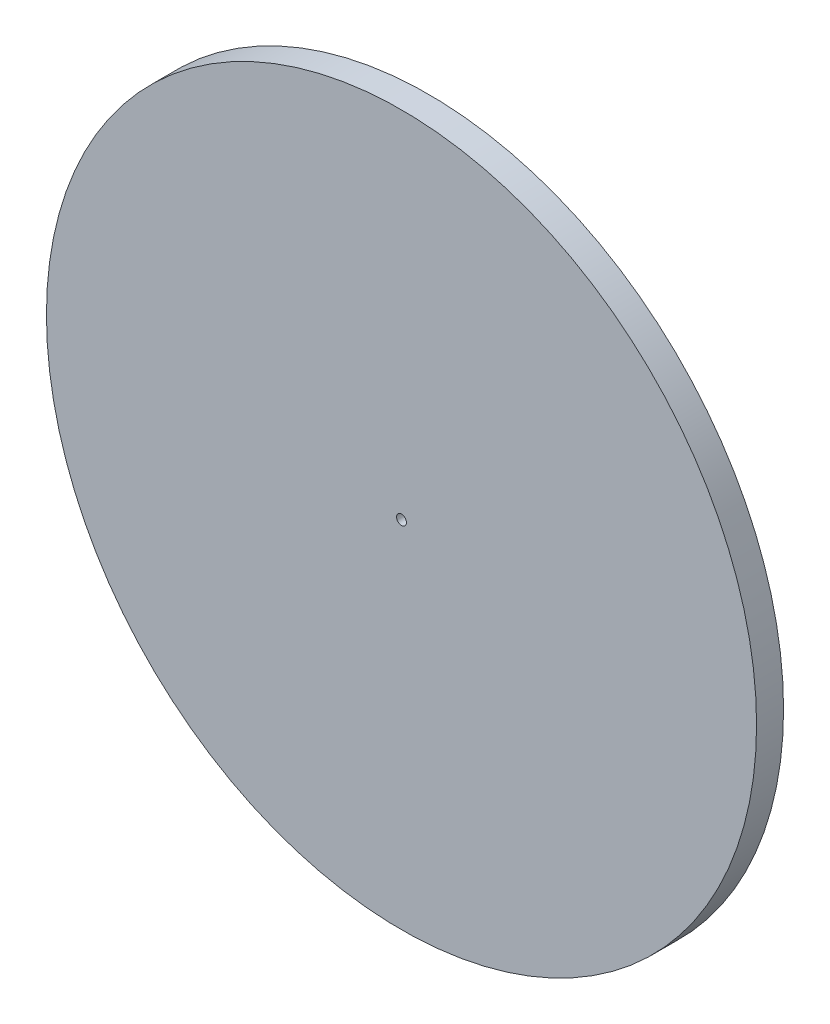
ISO-10303-21;
HEADER;
FILE_DESCRIPTION(('STEP AP214'),'2;1');
FILE_NAME('part.step','',(''),(''),'','','');
FILE_SCHEMA(('AUTOMOTIVE_DESIGN { 1 0 10303 214 1 1 1 1 }'));
ENDSEC;
DATA;
#1=APPLICATION_CONTEXT('core data for automotive mechanical design processes');
#2=APPLICATION_PROTOCOL_DEFINITION('international standard','automotive_design',2000,#1);
#3=PRODUCT_CONTEXT('',#1,'mechanical');
#4=PRODUCT('Part','Part','',(#3));
#5=PRODUCT_RELATED_PRODUCT_CATEGORY('part','',(#4));
#6=PRODUCT_DEFINITION_FORMATION('','',#4);
#7=PRODUCT_DEFINITION_CONTEXT('part definition',#1,'design');
#8=PRODUCT_DEFINITION('design','',#6,#7);
#9=PRODUCT_DEFINITION_SHAPE('','',#8);
#10=(LENGTH_UNIT() NAMED_UNIT(*) SI_UNIT(.MILLI.,.METRE.));
#11=(NAMED_UNIT(*) PLANE_ANGLE_UNIT() SI_UNIT($,.RADIAN.));
#12=(NAMED_UNIT(*) SI_UNIT($,.STERADIAN.) SOLID_ANGLE_UNIT());
#13=UNCERTAINTY_MEASURE_WITH_UNIT(LENGTH_MEASURE(1.E-05),#10,'distance_accuracy_value','');
#14=(GEOMETRIC_REPRESENTATION_CONTEXT(3) GLOBAL_UNCERTAINTY_ASSIGNED_CONTEXT((#13)) GLOBAL_UNIT_ASSIGNED_CONTEXT((#10,
#11,#12)) REPRESENTATION_CONTEXT('',''));
#15=CARTESIAN_POINT('',(0.,0.,0.));
#16=DIRECTION('',(0.,0.,1.));
#17=DIRECTION('',(1.,0.,0.));
#18=AXIS2_PLACEMENT_3D('',#15,#16,#17);
#19=CARTESIAN_POINT('',(0.,0.,9.5));
#20=DIRECTION('',(0.,0.,-1.));
#21=DIRECTION('',(-1.,0.,0.));
#22=AXIS2_PLACEMENT_3D('',#19,#20,#21);
#23=CYLINDRICAL_SURFACE('',#22,3.5);
#24=CARTESIAN_POINT('',(0.,0.,9.5));
#25=DIRECTION('',(0.,0.,1.));
#26=DIRECTION('',(1.,0.,0.));
#27=AXIS2_PLACEMENT_3D('',#24,#25,#26);
#28=CIRCLE('',#27,3.5);
#29=CARTESIAN_POINT('',(3.5,0.,9.5));
#30=VERTEX_POINT('',#29);
#31=EDGE_CURVE('E52',#30,#30,#28,.T.);
#32=ORIENTED_EDGE('',*,*,#31,.T.);
#33=EDGE_LOOP('',(#32));
#34=FACE_BOUND('',#33,.T.);
#35=CARTESIAN_POINT('',(0.,0.,-0.5));
#36=DIRECTION('',(0.,0.,-1.));
#37=DIRECTION('',(-1.,0.,0.));
#38=AXIS2_PLACEMENT_3D('',#35,#36,#37);
#39=CIRCLE('',#38,3.5);
#40=CARTESIAN_POINT('',(-3.5,0.,-0.5));
#41=VERTEX_POINT('',#40);
#42=EDGE_CURVE('E41',#41,#41,#39,.T.);
#43=ORIENTED_EDGE('',*,*,#42,.T.);
#44=EDGE_LOOP('',(#43));
#45=FACE_BOUND('',#44,.T.);
#46=ADVANCED_FACE('F37',(#34,#45),#23,.F.);
#47=CARTESIAN_POINT('',(0.,0.,9.5));
#48=DIRECTION('',(0.,0.,1.));
#49=DIRECTION('',(1.,0.,0.));
#50=AXIS2_PLACEMENT_3D('',#47,#48,#49);
#51=PLANE('',#50);
#52=CARTESIAN_POINT('',(0.,0.,9.5));
#53=DIRECTION('',(0.,0.,1.));
#54=DIRECTION('',(1.,0.,0.));
#55=AXIS2_PLACEMENT_3D('',#52,#53,#54);
#56=CIRCLE('',#55,250.);
#57=CARTESIAN_POINT('',(250.,0.,9.5));
#58=VERTEX_POINT('',#57);
#59=EDGE_CURVE('E10',#58,#58,#56,.T.);
#60=ORIENTED_EDGE('',*,*,#59,.T.);
#61=EDGE_LOOP('',(#60));
#62=FACE_BOUND('',#61,.T.);
#63=ORIENTED_EDGE('',*,*,#31,.F.);
#64=EDGE_LOOP('',(#63));
#65=FACE_BOUND('',#64,.T.);
#66=ADVANCED_FACE('F81',(#62,#65),#51,.T.);
#67=CARTESIAN_POINT('',(0.,0.,-9.5));
#68=DIRECTION('',(0.,0.,1.));
#69=DIRECTION('',(1.,0.,0.));
#70=AXIS2_PLACEMENT_3D('',#67,#68,#69);
#71=PLANE('',#70);
#72=CARTESIAN_POINT('',(0.,0.,-9.5));
#73=DIRECTION('',(0.,0.,-1.));
#74=DIRECTION('',(-1.,0.,0.));
#75=AXIS2_PLACEMENT_3D('',#72,#73,#74);
#76=CIRCLE('',#75,31.);
#77=CARTESIAN_POINT('',(-31.,0.,-9.5));
#78=VERTEX_POINT('',#77);
#79=EDGE_CURVE('E57',#78,#78,#76,.T.);
#80=ORIENTED_EDGE('',*,*,#79,.F.);
#81=EDGE_LOOP('',(#80));
#82=FACE_BOUND('',#81,.T.);
#83=CARTESIAN_POINT('',(0.,0.,-9.5));
#84=DIRECTION('',(0.,0.,1.));
#85=DIRECTION('',(1.,0.,0.));
#86=AXIS2_PLACEMENT_3D('',#83,#84,#85);
#87=CIRCLE('',#86,250.);
#88=CARTESIAN_POINT('',(250.,0.,-9.5));
#89=VERTEX_POINT('',#88);
#90=EDGE_CURVE('E46',#89,#89,#87,.T.);
#91=ORIENTED_EDGE('',*,*,#90,.F.);
#92=EDGE_LOOP('',(#91));
#93=FACE_BOUND('',#92,.T.);
#94=ADVANCED_FACE('F87',(#82,#93),#71,.F.);
#95=CARTESIAN_POINT('',(0.,0.,9.5));
#96=DIRECTION('',(0.,0.,-1.));
#97=DIRECTION('',(-1.,0.,0.));
#98=AXIS2_PLACEMENT_3D('',#95,#96,#97);
#99=CYLINDRICAL_SURFACE('',#98,250.);
#100=ORIENTED_EDGE('',*,*,#59,.F.);
#101=EDGE_LOOP('',(#100));
#102=FACE_BOUND('',#101,.T.);
#103=ORIENTED_EDGE('',*,*,#90,.T.);
#104=EDGE_LOOP('',(#103));
#105=FACE_BOUND('',#104,.T.);
#106=ADVANCED_FACE('F39',(#102,#105),#99,.T.);
#107=CARTESIAN_POINT('',(0.,0.,-0.5));
#108=DIRECTION('',(0.,0.,-1.));
#109=DIRECTION('',(-1.,0.,0.));
#110=AXIS2_PLACEMENT_3D('',#107,#108,#109);
#111=CYLINDRICAL_SURFACE('',#110,31.);
#112=CARTESIAN_POINT('',(0.,0.,-0.5));
#113=DIRECTION('',(0.,0.,-1.));
#114=DIRECTION('',(-1.,0.,0.));
#115=AXIS2_PLACEMENT_3D('',#112,#113,#114);
#116=CIRCLE('',#115,31.);
#117=CARTESIAN_POINT('',(-31.,0.,-0.5));
#118=VERTEX_POINT('',#117);
#119=EDGE_CURVE('E61',#118,#118,#116,.T.);
#120=ORIENTED_EDGE('',*,*,#119,.F.);
#121=EDGE_LOOP('',(#120));
#122=FACE_BOUND('',#121,.T.);
#123=ORIENTED_EDGE('',*,*,#79,.T.);
#124=EDGE_LOOP('',(#123));
#125=FACE_BOUND('',#124,.T.);
#126=ADVANCED_FACE('F73',(#122,#125),#111,.F.);
#127=CARTESIAN_POINT('',(0.,0.,-0.5));
#128=DIRECTION('',(0.,0.,-1.));
#129=DIRECTION('',(-1.,0.,0.));
#130=AXIS2_PLACEMENT_3D('',#127,#128,#129);
#131=PLANE('',#130);
#132=ORIENTED_EDGE('',*,*,#42,.F.);
#133=EDGE_LOOP('',(#132));
#134=FACE_BOUND('',#133,.T.);
#135=ORIENTED_EDGE('',*,*,#119,.T.);
#136=EDGE_LOOP('',(#135));
#137=FACE_BOUND('',#136,.T.);
#138=ADVANCED_FACE('F71',(#134,#137),#131,.T.);
#139=CLOSED_SHELL('',(#46,#66,#94,#106,#126,#138));
#140=MANIFOLD_SOLID_BREP('B2',#139);
#141=ADVANCED_BREP_SHAPE_REPRESENTATION('',(#18,#140),#14);
#142=SHAPE_DEFINITION_REPRESENTATION(#9,#141);
ENDSEC;
END-ISO-10303-21;
